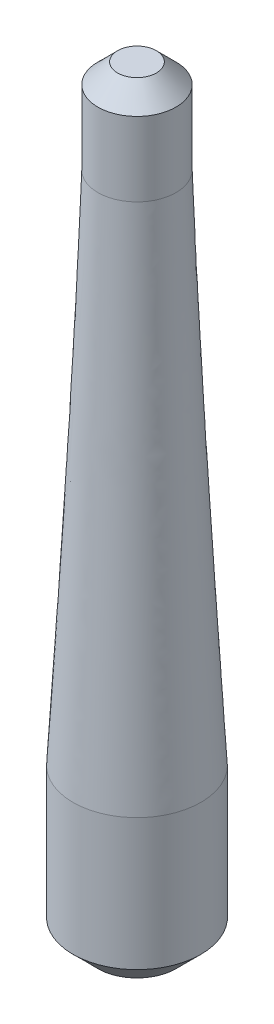
ISO-10303-21;
HEADER;
FILE_DESCRIPTION(('STEP AP214'),'2;1');
FILE_NAME('part.step','',(''),(''),'','','');
FILE_SCHEMA(('AUTOMOTIVE_DESIGN { 1 0 10303 214 1 1 1 1 }'));
ENDSEC;
DATA;
#1=APPLICATION_CONTEXT('core data for automotive mechanical design processes');
#2=APPLICATION_PROTOCOL_DEFINITION('international standard','automotive_design',2000,#1);
#3=PRODUCT_CONTEXT('',#1,'mechanical');
#4=PRODUCT('Part','Part','',(#3));
#5=PRODUCT_RELATED_PRODUCT_CATEGORY('part','',(#4));
#6=PRODUCT_DEFINITION_FORMATION('','',#4);
#7=PRODUCT_DEFINITION_CONTEXT('part definition',#1,'design');
#8=PRODUCT_DEFINITION('design','',#6,#7);
#9=PRODUCT_DEFINITION_SHAPE('','',#8);
#10=(LENGTH_UNIT() NAMED_UNIT(*) SI_UNIT(.MILLI.,.METRE.));
#11=(NAMED_UNIT(*) PLANE_ANGLE_UNIT() SI_UNIT($,.RADIAN.));
#12=(NAMED_UNIT(*) SI_UNIT($,.STERADIAN.) SOLID_ANGLE_UNIT());
#13=UNCERTAINTY_MEASURE_WITH_UNIT(LENGTH_MEASURE(1.E-05),#10,'distance_accuracy_value','');
#14=(GEOMETRIC_REPRESENTATION_CONTEXT(3) GLOBAL_UNCERTAINTY_ASSIGNED_CONTEXT((#13)) GLOBAL_UNIT_ASSIGNED_CONTEXT((#10,
#11,#12)) REPRESENTATION_CONTEXT('',''));
#15=CARTESIAN_POINT('',(0.,0.,0.));
#16=DIRECTION('',(0.,0.,1.));
#17=DIRECTION('',(1.,0.,0.));
#18=AXIS2_PLACEMENT_3D('',#15,#16,#17);
#19=CARTESIAN_POINT('',(-0.377380179985277,20.955,1.54199236371465));
#20=CARTESIAN_POINT('',(-1.75947664626454,0.,1.91422097241925));
#21=CARTESIAN_POINT('',(-3.46136490741457,20.955,0.787232003744093));
#22=CARTESIAN_POINT('',(-5.58791859110304,0.,-1.60473232010982));
#23=CARTESIAN_POINT('',(-2.70660454744401,20.955,-2.2967527236852));
#24=CARTESIAN_POINT('',(-2.06896529857396,0.,-5.43317426494832));
#25=CARTESIAN_POINT('',(0.377380179985277,20.955,-1.54199236371465));
#26=CARTESIAN_POINT('',(1.75947664626454,0.,-1.91422097241925));
#27=CARTESIAN_POINT('',(3.46136490741457,20.955,-0.787232003744093));
#28=CARTESIAN_POINT('',(5.58791859110304,0.,1.60473232010982));
#29=CARTESIAN_POINT('',(2.70660454744401,20.955,2.2967527236852));
#30=CARTESIAN_POINT('',(2.06896529857396,0.,5.43317426494832));
#31=CARTESIAN_POINT('',(-0.377380179985277,20.955,1.54199236371465));
#32=CARTESIAN_POINT('',(-1.75947664626454,0.,1.91422097241925));
#33=(BOUNDED_SURFACE() B_SPLINE_SURFACE(3,1,((#19,#20),(#21,#22),(#23,#24),(#25,#26),(#27,#28),
(#29,#30),(#31,#32)),.UNSPECIFIED.,.T.,.F.,.F.) B_SPLINE_SURFACE_WITH_KNOTS((4,3,4),(2,2),(0.,
0.5,1.),(0.,1.),.UNSPECIFIED.) GEOMETRIC_REPRESENTATION_ITEM() RATIONAL_B_SPLINE_SURFACE(((1.,
1.),(0.333333333333333,0.333333333333333),(0.333333333333333,0.333333333333333),(1.,1.),
(0.333333333333333,0.333333333333333),(0.333333333333333,0.333333333333333),(1.,1.))) REPRESENTATION_ITEM('') SURFACE());
#34=CARTESIAN_POINT('',(0.,20.955,0.));
#35=DIRECTION('',(0.,1.,0.));
#36=DIRECTION('',(0.,0.,1.));
#37=AXIS2_PLACEMENT_3D('',#34,#35,#36);
#38=CIRCLE('',#37,1.5875);
#39=CARTESIAN_POINT('',(-0.377380179985277,20.955,1.54199236371465));
#40=VERTEX_POINT('',#39);
#41=EDGE_CURVE('E64',#40,#40,#38,.T.);
#42=CARTESIAN_POINT('',(0.,0.,0.));
#43=DIRECTION('',(0.,-1.,0.));
#44=DIRECTION('',(0.,0.,-1.));
#45=AXIS2_PLACEMENT_3D('',#42,#43,#44);
#46=CIRCLE('',#45,2.6);
#47=CARTESIAN_POINT('',(-1.75947664626454,0.,1.91422097241925));
#48=VERTEX_POINT('',#47);
#49=EDGE_CURVE('E68',#48,#48,#46,.T.);
#50=CARTESIAN_POINT('',(-0.377380179985277,20.955,1.54199236371465));
#51=CARTESIAN_POINT('',(-0.391777018175686,20.73671875,1.54586974505532));
#52=CARTESIAN_POINT('',(-0.406173856366095,20.5184375,1.54974712639599));
#53=CARTESIAN_POINT('',(-0.434967532746912,20.081875,1.55750188907734));
#54=CARTESIAN_POINT('',(-0.449364370937321,19.86359375,1.56137927041801));
#55=CARTESIAN_POINT('',(-0.478158047318139,19.42703125,1.56913403309936));
#56=CARTESIAN_POINT('',(-0.492554885508548,19.20875,1.57301141444003));
#57=CARTESIAN_POINT('',(-0.521348561889366,18.7721875,1.58076617712138));
#58=CARTESIAN_POINT('',(-0.535745400079775,18.55390625,1.58464355846205));
#59=CARTESIAN_POINT('',(-0.564539076460593,18.11734375,1.59239832114339));
#60=CARTESIAN_POINT('',(-0.578935914651002,17.8990625,1.59627570248407));
#61=CARTESIAN_POINT('',(-0.60772959103182,17.4625,1.60403046516541));
#62=CARTESIAN_POINT('',(-0.622126429222229,17.24421875,1.60790784650609));
#63=CARTESIAN_POINT('',(-0.650920105603047,16.80765625,1.61566260918743));
#64=CARTESIAN_POINT('',(-0.665316943793456,16.589375,1.6195399905281));
#65=CARTESIAN_POINT('',(-0.694110620174273,16.1528125,1.62729475320945));
#66=CARTESIAN_POINT('',(-0.708507458364682,15.93453125,1.63117213455012));
#67=CARTESIAN_POINT('',(-0.7373011347455,15.49796875,1.63892689723147));
#68=CARTESIAN_POINT('',(-0.751697972935909,15.2796875,1.64280427857214));
#69=CARTESIAN_POINT('',(-0.780491649316727,14.843125,1.65055904125349));
#70=CARTESIAN_POINT('',(-0.794888487507136,14.62484375,1.65443642259416));
#71=CARTESIAN_POINT('',(-0.823682163887954,14.18828125,1.66219118527551));
#72=CARTESIAN_POINT('',(-0.838079002078363,13.97,1.66606856661618));
#73=CARTESIAN_POINT('',(-0.866872678459181,13.5334375,1.67382332929753));
#74=CARTESIAN_POINT('',(-0.88126951664959,13.31515625,1.6777007106382));
#75=CARTESIAN_POINT('',(-0.910063193030408,12.87859375,1.68545547331955));
#76=CARTESIAN_POINT('',(-0.924460031220817,12.6603125,1.68933285466022));
#77=CARTESIAN_POINT('',(-0.953253707601635,12.22375,1.69708761734156));
#78=CARTESIAN_POINT('',(-0.967650545792044,12.00546875,1.70096499868224));
#79=CARTESIAN_POINT('',(-0.996444222172861,11.56890625,1.70871976136358));
#80=CARTESIAN_POINT('',(-1.01084106036327,11.350625,1.71259714270426));
#81=CARTESIAN_POINT('',(-1.03963473674409,10.9140625,1.7203519053856));
#82=CARTESIAN_POINT('',(-1.0540315749345,10.69578125,1.72422928672627));
#83=CARTESIAN_POINT('',(-1.08282525131532,10.25921875,1.73198404940762));
#84=CARTESIAN_POINT('',(-1.09722208950572,10.0409375,1.73586143074829));
#85=CARTESIAN_POINT('',(-1.12601576588654,9.604375,1.74361619342964));
#86=CARTESIAN_POINT('',(-1.14041260407695,9.38609375,1.74749357477031));
#87=CARTESIAN_POINT('',(-1.16920628045777,8.94953125,1.75524833745166));
#88=CARTESIAN_POINT('',(-1.18360311864818,8.73125,1.75912571879233));
#89=CARTESIAN_POINT('',(-1.212396795029,8.2946875,1.76688048147368));
#90=CARTESIAN_POINT('',(-1.2267936332194,8.07640625,1.77075786281435));
#91=CARTESIAN_POINT('',(-1.25558730960022,7.63984375,1.7785126254957));
#92=CARTESIAN_POINT('',(-1.26998414779063,7.4215625,1.78239000683637));
#93=CARTESIAN_POINT('',(-1.29877782417145,6.985,1.79014476951772));
#94=CARTESIAN_POINT('',(-1.31317466236186,6.76671875,1.79402215085839));
#95=CARTESIAN_POINT('',(-1.34196833874268,6.33015625,1.80177691353973));
#96=CARTESIAN_POINT('',(-1.35636517693309,6.111875,1.80565429488041));
#97=CARTESIAN_POINT('',(-1.3851588533139,5.6753125,1.81340905756175));
#98=CARTESIAN_POINT('',(-1.39955569150431,5.45703125,1.81728643890243));
#99=CARTESIAN_POINT('',(-1.42834936788513,5.02046875,1.82504120158377));
#100=CARTESIAN_POINT('',(-1.44274620607554,4.8021875,1.82891858292444));
#101=CARTESIAN_POINT('',(-1.47153988245636,4.365625,1.83667334560579));
#102=CARTESIAN_POINT('',(-1.48593672064677,4.14734375,1.84055072694646));
#103=CARTESIAN_POINT('',(-1.51473039702758,3.71078125,1.84830548962781));
#104=CARTESIAN_POINT('',(-1.52912723521799,3.4925,1.85218287096848));
#105=CARTESIAN_POINT('',(-1.55792091159881,3.0559375,1.85993763364983));
#106=CARTESIAN_POINT('',(-1.57231774978922,2.83765625,1.8638150149905));
#107=CARTESIAN_POINT('',(-1.60111142617004,2.40109375,1.87156977767185));
#108=CARTESIAN_POINT('',(-1.61550826436045,2.1828125,1.87544715901252));
#109=CARTESIAN_POINT('',(-1.64430194074126,1.74625,1.88320192169387));
#110=CARTESIAN_POINT('',(-1.65869877893167,1.52796875,1.88707930303454));
#111=CARTESIAN_POINT('',(-1.68749245531249,1.09140625,1.89483406571589));
#112=CARTESIAN_POINT('',(-1.7018892935029,0.873125,1.89871144705656));
#113=CARTESIAN_POINT('',(-1.73068296988372,0.4365625,1.9064662097379));
#114=CARTESIAN_POINT('',(-1.74507980807413,0.21828125,1.91034359107858));
#115=CARTESIAN_POINT('',(-1.75947664626454,0.,1.91422097241925));
#116=B_SPLINE_CURVE_WITH_KNOTS('',3,(#50,#51,#52,#53,#54,#55,#56,#57,#58,#59,#60,#61,#62,#63,
#64,#65,#66,#67,#68,#69,#70,#71,#72,#73,#74,#75,#76,#77,#78,#79,#80,#81,#82,#83,#84,#85,#86,#87,
#88,#89,#90,#91,#92,#93,#94,#95,#96,#97,#98,#99,#100,#101,#102,#103,#104,#105,#106,#107,#108,
#109,#110,#111,#112,#113,#114,#115),.UNSPECIFIED.,.F.,.F.,(4,2,2,2,2,2,2,2,2,2,2,2,2,2,2,2,2,2,
2,2,2,2,2,2,2,2,2,2,2,2,2,2,4),(0.,0.656369609471323,1.31273921894265,1.96910882841397,
2.6254784378853,3.28184804735662,3.93821765682795,4.59458726629927,5.2509568757706,
5.90732648524192,6.56369609471324,7.22006570418457,7.87643531365589,8.53280492312721,
9.18917453259854,9.84554414206986,10.5019137515412,11.1582833610125,11.8146529704838,
12.4710225799552,13.1273921894265,13.7837617988978,14.4401314083691,15.0965010178405,
15.7528706273118,16.4092402367831,17.0656098462544,17.7219794557258,18.3783490651971,
19.0347186746684,19.6910882841397,20.3474578936111,21.0038275030824),.UNSPECIFIED.);
#117=EDGE_CURVE('BSEAM43',#40,#48,#116,.T.);
#118=ORIENTED_EDGE('',*,*,#41,.F.);
#119=ORIENTED_EDGE('',*,*,#49,.F.);
#120=ORIENTED_EDGE('',*,*,#117,.T.);
#121=ORIENTED_EDGE('',*,*,#117,.F.);
#122=EDGE_LOOP('',(#118,#120,#119,#121));
#123=FACE_BOUND('',#122,.T.);
#124=ADVANCED_FACE('F43',(#123),#33,.T.);
#125=CARTESIAN_POINT('',(0.,-6.35,0.));
#126=DIRECTION('',(0.,1.,0.));
#127=DIRECTION('',(0.,0.,1.));
#128=AXIS2_PLACEMENT_3D('',#125,#126,#127);
#129=CYLINDRICAL_SURFACE('',#128,2.6);
#130=CARTESIAN_POINT('',(0.,-5.34999999999999,0.));
#131=DIRECTION('',(0.,-1.,0.));
#132=DIRECTION('',(0.,0.,-1.));
#133=AXIS2_PLACEMENT_3D('',#130,#131,#132);
#134=CIRCLE('',#133,2.6);
#135=CARTESIAN_POINT('',(0.,-5.34999999999999,-2.6));
#136=VERTEX_POINT('',#135);
#137=EDGE_CURVE('E55',#136,#136,#134,.F.);
#138=ORIENTED_EDGE('',*,*,#137,.T.);
#139=EDGE_LOOP('',(#138));
#140=FACE_BOUND('',#139,.T.);
#141=ORIENTED_EDGE('',*,*,#49,.T.);
#142=EDGE_LOOP('',(#141));
#143=FACE_BOUND('',#142,.T.);
#144=ADVANCED_FACE('F89',(#140,#143),#129,.T.);
#145=CARTESIAN_POINT('',(0.,-6.35,0.));
#146=DIRECTION('',(0.,-1.,0.));
#147=DIRECTION('',(0.,0.,-1.));
#148=AXIS2_PLACEMENT_3D('',#145,#146,#147);
#149=PLANE('',#148);
#150=CARTESIAN_POINT('',(0.,-6.35,0.));
#151=DIRECTION('',(0.,-1.,0.));
#152=DIRECTION('',(0.,0.,-1.));
#153=AXIS2_PLACEMENT_3D('',#150,#151,#152);
#154=CIRCLE('',#153,1.59999999999999);
#155=CARTESIAN_POINT('',(0.,-6.35,-1.59999999999999));
#156=VERTEX_POINT('',#155);
#157=EDGE_CURVE('E59',#156,#156,#154,.T.);
#158=ORIENTED_EDGE('',*,*,#157,.T.);
#159=EDGE_LOOP('',(#158));
#160=FACE_BOUND('',#159,.T.);
#161=ADVANCED_FACE('F98',(#160),#149,.T.);
#162=CARTESIAN_POINT('',(0.,24.765,0.));
#163=DIRECTION('',(0.,-1.,0.));
#164=DIRECTION('',(0.,0.,-1.));
#165=AXIS2_PLACEMENT_3D('',#162,#163,#164);
#166=CYLINDRICAL_SURFACE('',#165,1.5875);
#167=CARTESIAN_POINT('',(0.,23.965,0.));
#168=DIRECTION('',(0.,1.,0.));
#169=DIRECTION('',(0.,0.,1.));
#170=AXIS2_PLACEMENT_3D('',#167,#168,#169);
#171=CIRCLE('',#170,1.5875);
#172=CARTESIAN_POINT('',(0.,23.965,1.5875));
#173=VERTEX_POINT('',#172);
#174=EDGE_CURVE('E11',#173,#173,#171,.F.);
#175=ORIENTED_EDGE('',*,*,#174,.T.);
#176=EDGE_LOOP('',(#175));
#177=FACE_BOUND('',#176,.T.);
#178=ORIENTED_EDGE('',*,*,#41,.T.);
#179=EDGE_LOOP('',(#178));
#180=FACE_BOUND('',#179,.T.);
#181=ADVANCED_FACE('F125',(#177,#180),#166,.T.);
#182=CARTESIAN_POINT('',(0.,24.765,0.));
#183=DIRECTION('',(0.,1.,0.));
#184=DIRECTION('',(0.,0.,1.));
#185=AXIS2_PLACEMENT_3D('',#182,#183,#184);
#186=PLANE('',#185);
#187=CARTESIAN_POINT('',(0.,24.765,0.));
#188=DIRECTION('',(0.,1.,0.));
#189=DIRECTION('',(0.,0.,1.));
#190=AXIS2_PLACEMENT_3D('',#187,#188,#189);
#191=CIRCLE('',#190,0.78750000000001);
#192=CARTESIAN_POINT('',(0.,24.765,0.78750000000001));
#193=VERTEX_POINT('',#192);
#194=EDGE_CURVE('E51',#193,#193,#191,.T.);
#195=ORIENTED_EDGE('',*,*,#194,.T.);
#196=EDGE_LOOP('',(#195));
#197=FACE_BOUND('',#196,.T.);
#198=ADVANCED_FACE('F128',(#197),#186,.T.);
#199=CARTESIAN_POINT('',(0.,-6.35,0.));
#200=DIRECTION('',(0.,1.,0.));
#201=DIRECTION('',(0.,0.,1.));
#202=AXIS2_PLACEMENT_3D('',#199,#200,#201);
#203=CONICAL_SURFACE('',#202,1.59999999999999,0.785398163397448);
#204=ORIENTED_EDGE('',*,*,#137,.F.);
#205=EDGE_LOOP('',(#204));
#206=FACE_BOUND('',#205,.T.);
#207=ORIENTED_EDGE('',*,*,#157,.F.);
#208=EDGE_LOOP('',(#207));
#209=FACE_BOUND('',#208,.T.);
#210=ADVANCED_FACE('F106',(#206,#209),#203,.T.);
#211=CARTESIAN_POINT('',(0.,24.765,0.));
#212=DIRECTION('',(0.,-1.,0.));
#213=DIRECTION('',(0.,0.,-1.));
#214=AXIS2_PLACEMENT_3D('',#211,#212,#213);
#215=CONICAL_SURFACE('',#214,0.78750000000001,0.785398163397447);
#216=ORIENTED_EDGE('',*,*,#174,.F.);
#217=EDGE_LOOP('',(#216));
#218=FACE_BOUND('',#217,.T.);
#219=ORIENTED_EDGE('',*,*,#194,.F.);
#220=EDGE_LOOP('',(#219));
#221=FACE_BOUND('',#220,.T.);
#222=ADVANCED_FACE('F46',(#218,#221),#215,.T.);
#223=CLOSED_SHELL('',(#124,#144,#161,#181,#198,#210,#222));
#224=MANIFOLD_SOLID_BREP('B2',#223);
#225=ADVANCED_BREP_SHAPE_REPRESENTATION('',(#18,#224),#14);
#226=SHAPE_DEFINITION_REPRESENTATION(#9,#225);
ENDSEC;
END-ISO-10303-21;
